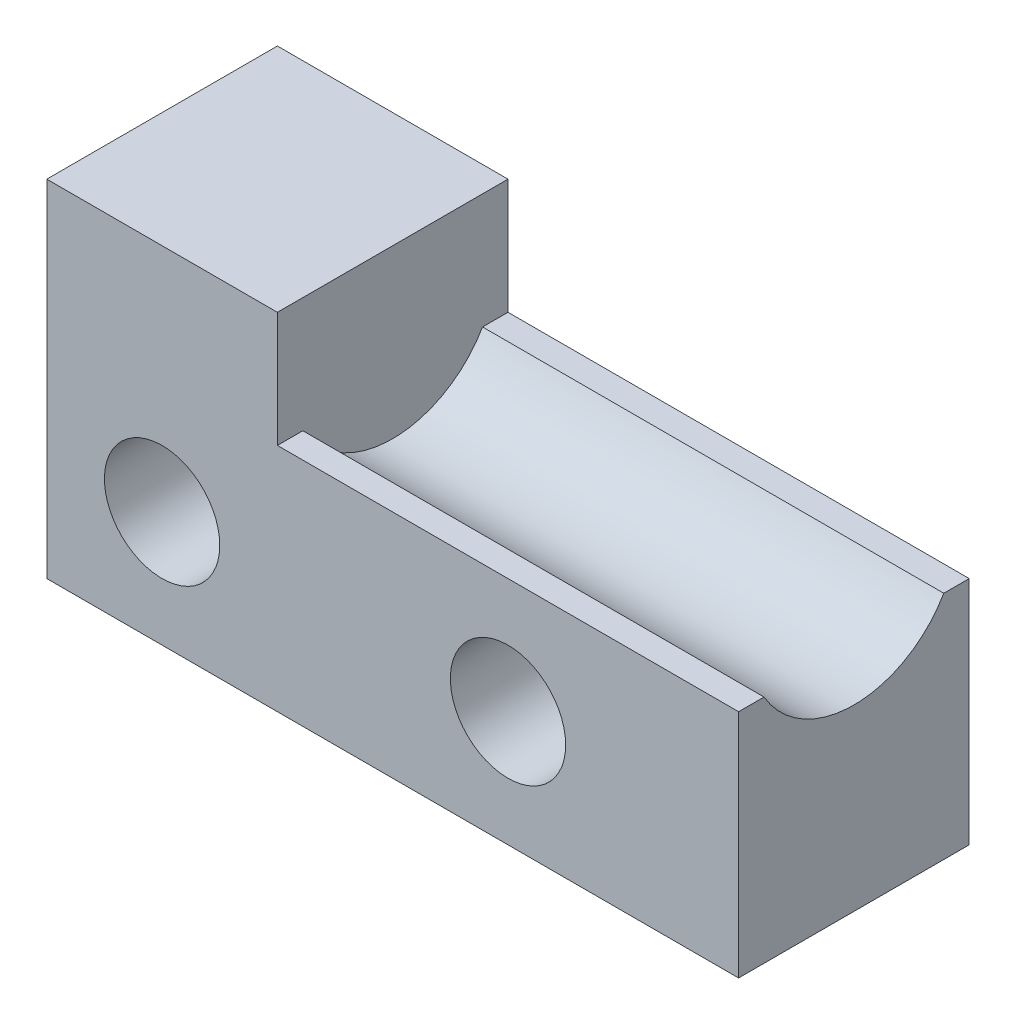
ISO-10303-21;
HEADER;
FILE_DESCRIPTION(('STEP AP214'),'2;1');
FILE_NAME('part.step','',(''),(''),'','','');
FILE_SCHEMA(('AUTOMOTIVE_DESIGN { 1 0 10303 214 1 1 1 1 }'));
ENDSEC;
DATA;
#1=APPLICATION_CONTEXT('core data for automotive mechanical design processes');
#2=APPLICATION_PROTOCOL_DEFINITION('international standard','automotive_design',2000,#1);
#3=PRODUCT_CONTEXT('',#1,'mechanical');
#4=PRODUCT('Part','Part','',(#3));
#5=PRODUCT_RELATED_PRODUCT_CATEGORY('part','',(#4));
#6=PRODUCT_DEFINITION_FORMATION('','',#4);
#7=PRODUCT_DEFINITION_CONTEXT('part definition',#1,'design');
#8=PRODUCT_DEFINITION('design','',#6,#7);
#9=PRODUCT_DEFINITION_SHAPE('','',#8);
#10=(LENGTH_UNIT() NAMED_UNIT(*) SI_UNIT(.MILLI.,.METRE.));
#11=(NAMED_UNIT(*) PLANE_ANGLE_UNIT() SI_UNIT($,.RADIAN.));
#12=(NAMED_UNIT(*) SI_UNIT($,.STERADIAN.) SOLID_ANGLE_UNIT());
#13=UNCERTAINTY_MEASURE_WITH_UNIT(LENGTH_MEASURE(1.E-05),#10,'distance_accuracy_value','');
#14=(GEOMETRIC_REPRESENTATION_CONTEXT(3) GLOBAL_UNCERTAINTY_ASSIGNED_CONTEXT((#13)) GLOBAL_UNIT_ASSIGNED_CONTEXT((#10,
#11,#12)) REPRESENTATION_CONTEXT('',''));
#15=CARTESIAN_POINT('',(0.,0.,0.));
#16=DIRECTION('',(0.,0.,1.));
#17=DIRECTION('',(1.,0.,0.));
#18=AXIS2_PLACEMENT_3D('',#15,#16,#17);
#19=CARTESIAN_POINT('',(10.,10.,10.));
#20=DIRECTION('',(0.,-1.,0.));
#21=DIRECTION('',(1.,0.,0.));
#22=AXIS2_PLACEMENT_3D('',#19,#20,#21);
#23=PLANE('',#22);
#24=DIRECTION('',(0.,0.,-1.));
#25=VECTOR('',#24,1.);
#26=CARTESIAN_POINT('',(10.,10.,10.));
#27=LINE('',#26,#25);
#28=CARTESIAN_POINT('',(10.,10.,1.10288568297003));
#29=VERTEX_POINT('',#28);
#30=CARTESIAN_POINT('',(10.,10.,0.));
#31=VERTEX_POINT('',#30);
#32=EDGE_CURVE('E122',#29,#31,#27,.T.);
#33=ORIENTED_EDGE('',*,*,#32,.F.);
#34=DIRECTION('',(1.,0.,0.));
#35=VECTOR('',#34,1.);
#36=CARTESIAN_POINT('',(-2.72792206135785,10.,1.10288568297003));
#37=LINE('',#36,#35);
#38=CARTESIAN_POINT('',(30.,10.,1.10288568297003));
#39=VERTEX_POINT('',#38);
#40=EDGE_CURVE('E158',#29,#39,#37,.T.);
#41=ORIENTED_EDGE('',*,*,#40,.T.);
#42=DIRECTION('',(0.,0.,-1.));
#43=VECTOR('',#42,1.);
#44=CARTESIAN_POINT('',(30.,10.,10.));
#45=LINE('',#44,#43);
#46=CARTESIAN_POINT('',(30.,10.,0.));
#47=VERTEX_POINT('',#46);
#48=EDGE_CURVE('E149',#39,#47,#45,.T.);
#49=ORIENTED_EDGE('',*,*,#48,.T.);
#50=DIRECTION('',(-1.,0.,0.));
#51=VECTOR('',#50,1.);
#52=CARTESIAN_POINT('',(10.,10.,0.));
#53=LINE('',#52,#51);
#54=EDGE_CURVE('E138',#47,#31,#53,.T.);
#55=ORIENTED_EDGE('',*,*,#54,.T.);
#56=EDGE_LOOP('',(#33,#41,#49,#55));
#57=FACE_BOUND('',#56,.T.);
#58=ADVANCED_FACE('F34',(#57),#23,.F.);
#59=CARTESIAN_POINT('',(0.,0.,10.));
#60=DIRECTION('',(0.,0.,-1.));
#61=DIRECTION('',(-1.,0.,0.));
#62=AXIS2_PLACEMENT_3D('',#59,#60,#61);
#63=PLANE('',#62);
#64=DIRECTION('',(1.,0.,0.));
#65=VECTOR('',#64,1.);
#66=CARTESIAN_POINT('',(30.,0.,10.));
#67=LINE('',#66,#65);
#68=CARTESIAN_POINT('',(0.,0.,10.));
#69=VERTEX_POINT('',#68);
#70=CARTESIAN_POINT('',(30.,0.,10.));
#71=VERTEX_POINT('',#70);
#72=EDGE_CURVE('E145',#69,#71,#67,.T.);
#73=ORIENTED_EDGE('',*,*,#72,.T.);
#74=DIRECTION('',(0.,1.,0.));
#75=VECTOR('',#74,1.);
#76=CARTESIAN_POINT('',(30.,10.,10.));
#77=LINE('',#76,#75);
#78=CARTESIAN_POINT('',(30.,10.,10.));
#79=VERTEX_POINT('',#78);
#80=EDGE_CURVE('E93',#71,#79,#77,.T.);
#81=ORIENTED_EDGE('',*,*,#80,.T.);
#82=DIRECTION('',(-1.,0.,0.));
#83=VECTOR('',#82,1.);
#84=CARTESIAN_POINT('',(10.,10.,10.));
#85=LINE('',#84,#83);
#86=CARTESIAN_POINT('',(10.,10.,10.));
#87=VERTEX_POINT('',#86);
#88=EDGE_CURVE('E110',#79,#87,#85,.T.);
#89=ORIENTED_EDGE('',*,*,#88,.T.);
#90=DIRECTION('',(0.,1.,0.));
#91=VECTOR('',#90,1.);
#92=CARTESIAN_POINT('',(10.,15.,10.));
#93=LINE('',#92,#91);
#94=CARTESIAN_POINT('',(10.,15.,10.));
#95=VERTEX_POINT('',#94);
#96=EDGE_CURVE('E102',#87,#95,#93,.T.);
#97=ORIENTED_EDGE('',*,*,#96,.T.);
#98=DIRECTION('',(-1.,0.,0.));
#99=VECTOR('',#98,1.);
#100=CARTESIAN_POINT('',(0.,15.,10.));
#101=LINE('',#100,#99);
#102=CARTESIAN_POINT('',(0.,15.,10.));
#103=VERTEX_POINT('',#102);
#104=EDGE_CURVE('E107',#95,#103,#101,.T.);
#105=ORIENTED_EDGE('',*,*,#104,.T.);
#106=DIRECTION('',(0.,-1.,0.));
#107=VECTOR('',#106,1.);
#108=CARTESIAN_POINT('',(0.,0.,10.));
#109=LINE('',#108,#107);
#110=EDGE_CURVE('E58',#103,#69,#109,.T.);
#111=ORIENTED_EDGE('',*,*,#110,.T.);
#112=EDGE_LOOP('',(#73,#81,#89,#97,#105,#111));
#113=FACE_BOUND('',#112,.T.);
#114=CARTESIAN_POINT('',(5.,5.,10.));
#115=DIRECTION('',(0.,0.,1.));
#116=DIRECTION('',(1.,0.,0.));
#117=AXIS2_PLACEMENT_3D('',#114,#115,#116);
#118=CIRCLE('',#117,2.5);
#119=CARTESIAN_POINT('',(7.5,5.,10.));
#120=VERTEX_POINT('',#119);
#121=EDGE_CURVE('E135',#120,#120,#118,.T.);
#122=ORIENTED_EDGE('',*,*,#121,.F.);
#123=EDGE_LOOP('',(#122));
#124=FACE_BOUND('',#123,.T.);
#125=CARTESIAN_POINT('',(20.,5.,10.));
#126=DIRECTION('',(0.,0.,1.));
#127=DIRECTION('',(1.,0.,0.));
#128=AXIS2_PLACEMENT_3D('',#125,#126,#127);
#129=CIRCLE('',#128,2.5);
#130=CARTESIAN_POINT('',(22.5,5.,10.));
#131=VERTEX_POINT('',#130);
#132=EDGE_CURVE('E175',#131,#131,#129,.T.);
#133=ORIENTED_EDGE('',*,*,#132,.F.);
#134=EDGE_LOOP('',(#133));
#135=FACE_BOUND('',#134,.T.);
#136=ADVANCED_FACE('F104',(#113,#124,#135),#63,.F.);
#137=CARTESIAN_POINT('',(0.,0.,0.));
#138=DIRECTION('',(0.,0.,-1.));
#139=DIRECTION('',(-1.,0.,0.));
#140=AXIS2_PLACEMENT_3D('',#137,#138,#139);
#141=PLANE('',#140);
#142=CARTESIAN_POINT('',(5.,5.,0.));
#143=DIRECTION('',(0.,0.,1.));
#144=DIRECTION('',(1.,0.,0.));
#145=AXIS2_PLACEMENT_3D('',#142,#143,#144);
#146=CIRCLE('',#145,2.5);
#147=CARTESIAN_POINT('',(7.5,5.,0.));
#148=VERTEX_POINT('',#147);
#149=EDGE_CURVE('E172',#148,#148,#146,.T.);
#150=ORIENTED_EDGE('',*,*,#149,.T.);
#151=EDGE_LOOP('',(#150));
#152=FACE_BOUND('',#151,.T.);
#153=DIRECTION('',(1.,0.,0.));
#154=VECTOR('',#153,1.);
#155=CARTESIAN_POINT('',(30.,0.,0.));
#156=LINE('',#155,#154);
#157=CARTESIAN_POINT('',(0.,0.,0.));
#158=VERTEX_POINT('',#157);
#159=CARTESIAN_POINT('',(30.,0.,0.));
#160=VERTEX_POINT('',#159);
#161=EDGE_CURVE('E131',#158,#160,#156,.T.);
#162=ORIENTED_EDGE('',*,*,#161,.F.);
#163=DIRECTION('',(0.,-1.,0.));
#164=VECTOR('',#163,1.);
#165=CARTESIAN_POINT('',(0.,0.,0.));
#166=LINE('',#165,#164);
#167=CARTESIAN_POINT('',(0.,15.,0.));
#168=VERTEX_POINT('',#167);
#169=EDGE_CURVE('E85',#168,#158,#166,.T.);
#170=ORIENTED_EDGE('',*,*,#169,.F.);
#171=DIRECTION('',(-1.,0.,0.));
#172=VECTOR('',#171,1.);
#173=CARTESIAN_POINT('',(0.,15.,0.));
#174=LINE('',#173,#172);
#175=CARTESIAN_POINT('',(10.,15.,0.));
#176=VERTEX_POINT('',#175);
#177=EDGE_CURVE('E142',#176,#168,#174,.T.);
#178=ORIENTED_EDGE('',*,*,#177,.F.);
#179=DIRECTION('',(0.,1.,0.));
#180=VECTOR('',#179,1.);
#181=CARTESIAN_POINT('',(10.,15.,0.));
#182=LINE('',#181,#180);
#183=EDGE_CURVE('E119',#31,#176,#182,.T.);
#184=ORIENTED_EDGE('',*,*,#183,.F.);
#185=ORIENTED_EDGE('',*,*,#54,.F.);
#186=DIRECTION('',(0.,1.,0.));
#187=VECTOR('',#186,1.);
#188=CARTESIAN_POINT('',(30.,10.,0.));
#189=LINE('',#188,#187);
#190=EDGE_CURVE('E134',#160,#47,#189,.T.);
#191=ORIENTED_EDGE('',*,*,#190,.F.);
#192=EDGE_LOOP('',(#162,#170,#178,#184,#185,#191));
#193=FACE_BOUND('',#192,.T.);
#194=CARTESIAN_POINT('',(20.,5.,0.));
#195=DIRECTION('',(0.,0.,1.));
#196=DIRECTION('',(1.,0.,0.));
#197=AXIS2_PLACEMENT_3D('',#194,#195,#196);
#198=CIRCLE('',#197,2.5);
#199=CARTESIAN_POINT('',(22.5,5.,0.));
#200=VERTEX_POINT('',#199);
#201=EDGE_CURVE('E178',#200,#200,#198,.T.);
#202=ORIENTED_EDGE('',*,*,#201,.T.);
#203=EDGE_LOOP('',(#202));
#204=FACE_BOUND('',#203,.T.);
#205=ADVANCED_FACE('F164',(#152,#193,#204),#141,.T.);
#206=CARTESIAN_POINT('',(30.,0.,10.));
#207=DIRECTION('',(0.,1.,0.));
#208=DIRECTION('',(-1.,0.,0.));
#209=AXIS2_PLACEMENT_3D('',#206,#207,#208);
#210=PLANE('',#209);
#211=ORIENTED_EDGE('',*,*,#161,.T.);
#212=DIRECTION('',(0.,0.,-1.));
#213=VECTOR('',#212,1.);
#214=CARTESIAN_POINT('',(30.,0.,10.));
#215=LINE('',#214,#213);
#216=EDGE_CURVE('E11',#71,#160,#215,.T.);
#217=ORIENTED_EDGE('',*,*,#216,.F.);
#218=ORIENTED_EDGE('',*,*,#72,.F.);
#219=DIRECTION('',(0.,0.,-1.));
#220=VECTOR('',#219,1.);
#221=CARTESIAN_POINT('',(0.,0.,10.));
#222=LINE('',#221,#220);
#223=EDGE_CURVE('E127',#69,#158,#222,.T.);
#224=ORIENTED_EDGE('',*,*,#223,.T.);
#225=EDGE_LOOP('',(#211,#217,#218,#224));
#226=FACE_BOUND('',#225,.T.);
#227=ADVANCED_FACE('F36',(#226),#210,.F.);
#228=CARTESIAN_POINT('',(30.,10.,10.));
#229=DIRECTION('',(-1.,0.,0.));
#230=DIRECTION('',(0.,0.,1.));
#231=AXIS2_PLACEMENT_3D('',#228,#229,#230);
#232=PLANE('',#231);
#233=ORIENTED_EDGE('',*,*,#48,.F.);
#234=CARTESIAN_POINT('',(30.,12.25,5.));
#235=DIRECTION('',(1.,0.,0.));
#236=DIRECTION('',(0.,0.,-1.));
#237=AXIS2_PLACEMENT_3D('',#234,#235,#236);
#238=CIRCLE('',#237,4.5);
#239=CARTESIAN_POINT('',(30.,10.,8.89711431702997));
#240=VERTEX_POINT('',#239);
#241=EDGE_CURVE('E187',#240,#39,#238,.T.);
#242=ORIENTED_EDGE('',*,*,#241,.F.);
#243=EDGE_CURVE('E42',#79,#240,#45,.T.);
#244=ORIENTED_EDGE('',*,*,#243,.F.);
#245=ORIENTED_EDGE('',*,*,#80,.F.);
#246=ORIENTED_EDGE('',*,*,#216,.T.);
#247=ORIENTED_EDGE('',*,*,#190,.T.);
#248=EDGE_LOOP('',(#233,#242,#244,#245,#246,#247));
#249=FACE_BOUND('',#248,.T.);
#250=ADVANCED_FACE('F160',(#249),#232,.F.);
#251=ORIENTED_EDGE('',*,*,#243,.T.);
#252=DIRECTION('',(1.,0.,0.));
#253=VECTOR('',#252,1.);
#254=CARTESIAN_POINT('',(-2.72792206135785,10.,8.89711431702997));
#255=LINE('',#254,#253);
#256=CARTESIAN_POINT('',(10.,10.,8.89711431702997));
#257=VERTEX_POINT('',#256);
#258=EDGE_CURVE('E184',#240,#257,#255,.F.);
#259=ORIENTED_EDGE('',*,*,#258,.T.);
#260=EDGE_CURVE('E148',#87,#257,#27,.T.);
#261=ORIENTED_EDGE('',*,*,#260,.F.);
#262=ORIENTED_EDGE('',*,*,#88,.F.);
#263=EDGE_LOOP('',(#251,#259,#261,#262));
#264=FACE_BOUND('',#263,.T.);
#265=ADVANCED_FACE('F192',(#264),#23,.F.);
#266=CARTESIAN_POINT('',(10.,15.,10.));
#267=DIRECTION('',(-1.,0.,0.));
#268=DIRECTION('',(0.,0.,1.));
#269=AXIS2_PLACEMENT_3D('',#266,#267,#268);
#270=PLANE('',#269);
#271=ORIENTED_EDGE('',*,*,#260,.T.);
#272=CARTESIAN_POINT('',(10.,12.25,5.));
#273=DIRECTION('',(-1.,0.,0.));
#274=DIRECTION('',(0.,0.,1.));
#275=AXIS2_PLACEMENT_3D('',#272,#273,#274);
#276=CIRCLE('',#275,4.5);
#277=EDGE_CURVE('E49',#257,#29,#276,.F.);
#278=ORIENTED_EDGE('',*,*,#277,.T.);
#279=ORIENTED_EDGE('',*,*,#32,.T.);
#280=ORIENTED_EDGE('',*,*,#183,.T.);
#281=DIRECTION('',(0.,0.,-1.));
#282=VECTOR('',#281,1.);
#283=CARTESIAN_POINT('',(10.,15.,10.));
#284=LINE('',#283,#282);
#285=EDGE_CURVE('E116',#95,#176,#284,.T.);
#286=ORIENTED_EDGE('',*,*,#285,.F.);
#287=ORIENTED_EDGE('',*,*,#96,.F.);
#288=EDGE_LOOP('',(#271,#278,#279,#280,#286,#287));
#289=FACE_BOUND('',#288,.T.);
#290=ADVANCED_FACE('F117',(#289),#270,.F.);
#291=CARTESIAN_POINT('',(0.,15.,10.));
#292=DIRECTION('',(0.,-1.,0.));
#293=DIRECTION('',(0.,0.,-1.));
#294=AXIS2_PLACEMENT_3D('',#291,#292,#293);
#295=PLANE('',#294);
#296=ORIENTED_EDGE('',*,*,#177,.T.);
#297=DIRECTION('',(0.,0.,-1.));
#298=VECTOR('',#297,1.);
#299=CARTESIAN_POINT('',(0.,15.,10.));
#300=LINE('',#299,#298);
#301=EDGE_CURVE('E123',#103,#168,#300,.T.);
#302=ORIENTED_EDGE('',*,*,#301,.F.);
#303=ORIENTED_EDGE('',*,*,#104,.F.);
#304=ORIENTED_EDGE('',*,*,#285,.T.);
#305=EDGE_LOOP('',(#296,#302,#303,#304));
#306=FACE_BOUND('',#305,.T.);
#307=ADVANCED_FACE('F125',(#306),#295,.F.);
#308=CARTESIAN_POINT('',(0.,0.,10.));
#309=DIRECTION('',(1.,0.,0.));
#310=DIRECTION('',(0.,0.,-1.));
#311=AXIS2_PLACEMENT_3D('',#308,#309,#310);
#312=PLANE('',#311);
#313=ORIENTED_EDGE('',*,*,#169,.T.);
#314=ORIENTED_EDGE('',*,*,#223,.F.);
#315=ORIENTED_EDGE('',*,*,#110,.F.);
#316=ORIENTED_EDGE('',*,*,#301,.T.);
#317=EDGE_LOOP('',(#313,#314,#315,#316));
#318=FACE_BOUND('',#317,.T.);
#319=ADVANCED_FACE('F166',(#318),#312,.F.);
#320=CARTESIAN_POINT('',(5.,5.,10.));
#321=DIRECTION('',(0.,0.,-1.));
#322=DIRECTION('',(-1.,0.,0.));
#323=AXIS2_PLACEMENT_3D('',#320,#321,#322);
#324=CYLINDRICAL_SURFACE('',#323,2.5);
#325=ORIENTED_EDGE('',*,*,#121,.T.);
#326=EDGE_LOOP('',(#325));
#327=FACE_BOUND('',#326,.T.);
#328=ORIENTED_EDGE('',*,*,#149,.F.);
#329=EDGE_LOOP('',(#328));
#330=FACE_BOUND('',#329,.T.);
#331=ADVANCED_FACE('F211',(#327,#330),#324,.F.);
#332=CARTESIAN_POINT('',(20.,5.,10.));
#333=DIRECTION('',(0.,0.,-1.));
#334=DIRECTION('',(-1.,0.,0.));
#335=AXIS2_PLACEMENT_3D('',#332,#333,#334);
#336=CYLINDRICAL_SURFACE('',#335,2.5);
#337=ORIENTED_EDGE('',*,*,#132,.T.);
#338=EDGE_LOOP('',(#337));
#339=FACE_BOUND('',#338,.T.);
#340=ORIENTED_EDGE('',*,*,#201,.F.);
#341=EDGE_LOOP('',(#340));
#342=FACE_BOUND('',#341,.T.);
#343=ADVANCED_FACE('F233',(#339,#342),#336,.F.);
#344=CARTESIAN_POINT('',(-2.72792206135785,12.25,5.));
#345=DIRECTION('',(1.,0.,0.));
#346=DIRECTION('',(0.,0.,-1.));
#347=AXIS2_PLACEMENT_3D('',#344,#345,#346);
#348=CYLINDRICAL_SURFACE('',#347,4.5);
#349=ORIENTED_EDGE('',*,*,#277,.F.);
#350=ORIENTED_EDGE('',*,*,#258,.F.);
#351=ORIENTED_EDGE('',*,*,#241,.T.);
#352=ORIENTED_EDGE('',*,*,#40,.F.);
#353=EDGE_LOOP('',(#349,#350,#351,#352));
#354=FACE_BOUND('',#353,.T.);
#355=ADVANCED_FACE('F189',(#354),#348,.F.);
#356=CLOSED_SHELL('',(#58,#136,#205,#227,#250,#265,#290,#307,#319,#331,#343,#355));
#357=MANIFOLD_SOLID_BREP('B2',#356);
#358=ADVANCED_BREP_SHAPE_REPRESENTATION('',(#18,#357),#14);
#359=SHAPE_DEFINITION_REPRESENTATION(#9,#358);
ENDSEC;
END-ISO-10303-21;
